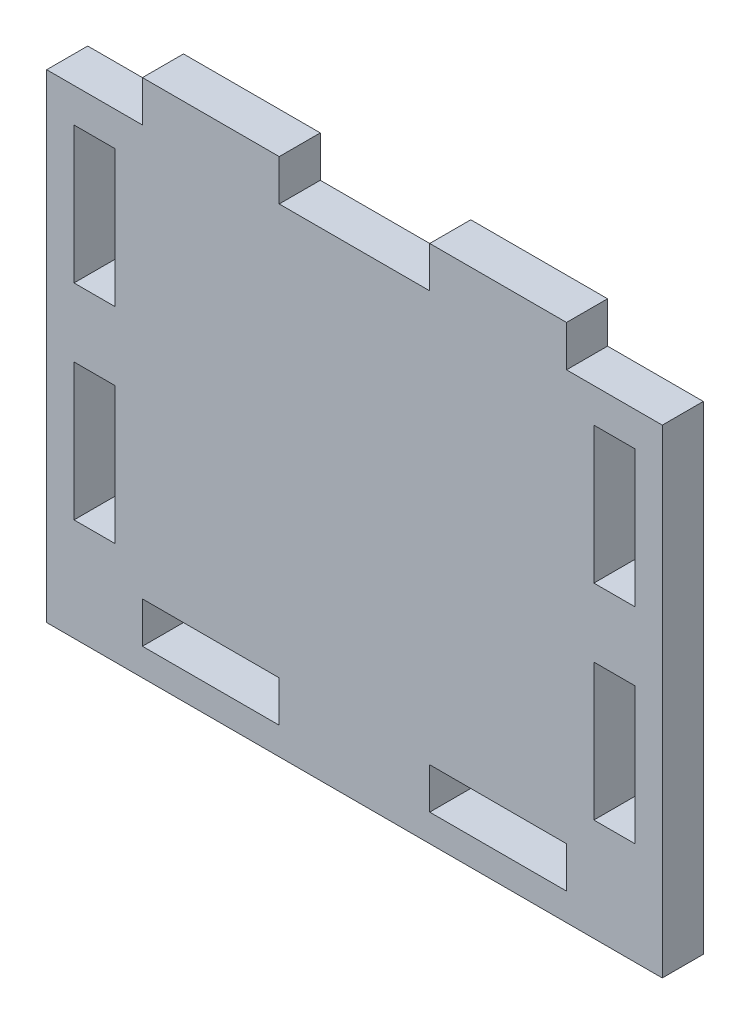
ISO-10303-21;
HEADER;
FILE_DESCRIPTION(('STEP AP214'),'2;1');
FILE_NAME('part.step','',(''),(''),'','','');
FILE_SCHEMA(('AUTOMOTIVE_DESIGN { 1 0 10303 214 1 1 1 1 }'));
ENDSEC;
DATA;
#1=APPLICATION_CONTEXT('core data for automotive mechanical design processes');
#2=APPLICATION_PROTOCOL_DEFINITION('international standard','automotive_design',2000,#1);
#3=PRODUCT_CONTEXT('',#1,'mechanical');
#4=PRODUCT('Part','Part','',(#3));
#5=PRODUCT_RELATED_PRODUCT_CATEGORY('part','',(#4));
#6=PRODUCT_DEFINITION_FORMATION('','',#4);
#7=PRODUCT_DEFINITION_CONTEXT('part definition',#1,'design');
#8=PRODUCT_DEFINITION('design','',#6,#7);
#9=PRODUCT_DEFINITION_SHAPE('','',#8);
#10=(LENGTH_UNIT() NAMED_UNIT(*) SI_UNIT(.MILLI.,.METRE.));
#11=(NAMED_UNIT(*) PLANE_ANGLE_UNIT() SI_UNIT($,.RADIAN.));
#12=(NAMED_UNIT(*) SI_UNIT($,.STERADIAN.) SOLID_ANGLE_UNIT());
#13=UNCERTAINTY_MEASURE_WITH_UNIT(LENGTH_MEASURE(1.E-05),#10,'distance_accuracy_value','');
#14=(GEOMETRIC_REPRESENTATION_CONTEXT(3) GLOBAL_UNCERTAINTY_ASSIGNED_CONTEXT((#13)) GLOBAL_UNIT_ASSIGNED_CONTEXT((#10,
#11,#12)) REPRESENTATION_CONTEXT('',''));
#15=CARTESIAN_POINT('',(0.,0.,0.));
#16=DIRECTION('',(0.,0.,1.));
#17=DIRECTION('',(1.,0.,0.));
#18=AXIS2_PLACEMENT_3D('',#15,#16,#17);
#19=CARTESIAN_POINT('',(0.,0.,3.));
#20=DIRECTION('',(0.,0.,-1.));
#21=DIRECTION('',(-1.,0.,0.));
#22=AXIS2_PLACEMENT_3D('',#19,#20,#21);
#23=PLANE('',#22);
#24=DIRECTION('',(0.,-1.,0.));
#25=VECTOR('',#24,1.);
#26=CARTESIAN_POINT('',(17.5,-12.5,3.));
#27=LINE('',#26,#25);
#28=CARTESIAN_POINT('',(17.5,-2.5,3.));
#29=VERTEX_POINT('',#28);
#30=CARTESIAN_POINT('',(17.5,-12.5,3.));
#31=VERTEX_POINT('',#30);
#32=EDGE_CURVE('E305',#29,#31,#27,.T.);
#33=ORIENTED_EDGE('',*,*,#32,.F.);
#34=DIRECTION('',(-1.,0.,0.));
#35=VECTOR('',#34,1.);
#36=CARTESIAN_POINT('',(17.5,-2.5,3.));
#37=LINE('',#36,#35);
#38=CARTESIAN_POINT('',(20.5,-2.5,3.));
#39=VERTEX_POINT('',#38);
#40=EDGE_CURVE('E313',#39,#29,#37,.T.);
#41=ORIENTED_EDGE('',*,*,#40,.F.);
#42=DIRECTION('',(0.,1.,0.));
#43=VECTOR('',#42,1.);
#44=CARTESIAN_POINT('',(20.5,-12.5,3.));
#45=LINE('',#44,#43);
#46=CARTESIAN_POINT('',(20.5,-12.5,3.));
#47=VERTEX_POINT('',#46);
#48=EDGE_CURVE('E310',#47,#39,#45,.T.);
#49=ORIENTED_EDGE('',*,*,#48,.F.);
#50=DIRECTION('',(1.,0.,0.));
#51=VECTOR('',#50,1.);
#52=CARTESIAN_POINT('',(17.5,-12.5,3.));
#53=LINE('',#52,#51);
#54=EDGE_CURVE('E307',#31,#47,#53,.T.);
#55=ORIENTED_EDGE('',*,*,#54,.F.);
#56=EDGE_LOOP('',(#33,#41,#49,#55));
#57=FACE_BOUND('',#56,.T.);
#58=DIRECTION('',(0.,1.,0.));
#59=VECTOR('',#58,1.);
#60=CARTESIAN_POINT('',(15.5,-15.,3.));
#61=LINE('',#60,#59);
#62=CARTESIAN_POINT('',(15.5,-18.,3.));
#63=VERTEX_POINT('',#62);
#64=CARTESIAN_POINT('',(15.5,-15.,3.));
#65=VERTEX_POINT('',#64);
#66=EDGE_CURVE('E367',#63,#65,#61,.T.);
#67=ORIENTED_EDGE('',*,*,#66,.F.);
#68=DIRECTION('',(1.,0.,0.));
#69=VECTOR('',#68,1.);
#70=CARTESIAN_POINT('',(15.5,-18.,3.));
#71=LINE('',#70,#69);
#72=CARTESIAN_POINT('',(5.5,-18.,3.));
#73=VERTEX_POINT('',#72);
#74=EDGE_CURVE('E375',#73,#63,#71,.T.);
#75=ORIENTED_EDGE('',*,*,#74,.F.);
#76=DIRECTION('',(0.,-1.,0.));
#77=VECTOR('',#76,1.);
#78=CARTESIAN_POINT('',(5.5,-15.,3.));
#79=LINE('',#78,#77);
#80=CARTESIAN_POINT('',(5.5,-15.,3.));
#81=VERTEX_POINT('',#80);
#82=EDGE_CURVE('E372',#81,#73,#79,.T.);
#83=ORIENTED_EDGE('',*,*,#82,.F.);
#84=DIRECTION('',(-1.,0.,0.));
#85=VECTOR('',#84,1.);
#86=CARTESIAN_POINT('',(15.5,-15.,3.));
#87=LINE('',#86,#85);
#88=EDGE_CURVE('E369',#65,#81,#87,.T.);
#89=ORIENTED_EDGE('',*,*,#88,.F.);
#90=EDGE_LOOP('',(#67,#75,#83,#89));
#91=FACE_BOUND('',#90,.T.);
#92=DIRECTION('',(0.,-1.,0.));
#93=VECTOR('',#92,1.);
#94=CARTESIAN_POINT('',(-15.5,-15.,3.));
#95=LINE('',#94,#93);
#96=CARTESIAN_POINT('',(-15.5,-15.,3.));
#97=VERTEX_POINT('',#96);
#98=CARTESIAN_POINT('',(-15.5,-18.,3.));
#99=VERTEX_POINT('',#98);
#100=EDGE_CURVE('E429',#97,#99,#95,.T.);
#101=ORIENTED_EDGE('',*,*,#100,.F.);
#102=DIRECTION('',(-1.,0.,0.));
#103=VECTOR('',#102,1.);
#104=CARTESIAN_POINT('',(-15.5,-15.,3.));
#105=LINE('',#104,#103);
#106=CARTESIAN_POINT('',(-5.5,-15.,3.));
#107=VERTEX_POINT('',#106);
#108=EDGE_CURVE('E437',#107,#97,#105,.T.);
#109=ORIENTED_EDGE('',*,*,#108,.F.);
#110=DIRECTION('',(0.,1.,0.));
#111=VECTOR('',#110,1.);
#112=CARTESIAN_POINT('',(-5.5,-15.,3.));
#113=LINE('',#112,#111);
#114=CARTESIAN_POINT('',(-5.5,-18.,3.));
#115=VERTEX_POINT('',#114);
#116=EDGE_CURVE('E434',#115,#107,#113,.T.);
#117=ORIENTED_EDGE('',*,*,#116,.F.);
#118=DIRECTION('',(1.,0.,0.));
#119=VECTOR('',#118,1.);
#120=CARTESIAN_POINT('',(-15.5,-18.,3.));
#121=LINE('',#120,#119);
#122=EDGE_CURVE('E431',#99,#115,#121,.T.);
#123=ORIENTED_EDGE('',*,*,#122,.F.);
#124=EDGE_LOOP('',(#101,#109,#117,#123));
#125=FACE_BOUND('',#124,.T.);
#126=DIRECTION('',(0.,1.,0.));
#127=VECTOR('',#126,1.);
#128=CARTESIAN_POINT('',(22.5,-20.,3.));
#129=LINE('',#128,#127);
#130=CARTESIAN_POINT('',(22.5,-20.,3.));
#131=VERTEX_POINT('',#130);
#132=CARTESIAN_POINT('',(22.5,15.,3.));
#133=VERTEX_POINT('',#132);
#134=EDGE_CURVE('E460',#131,#133,#129,.T.);
#135=ORIENTED_EDGE('',*,*,#134,.T.);
#136=DIRECTION('',(-1.,0.,0.));
#137=VECTOR('',#136,1.);
#138=CARTESIAN_POINT('',(15.5,15.,3.));
#139=LINE('',#138,#137);
#140=CARTESIAN_POINT('',(15.5,15.,3.));
#141=VERTEX_POINT('',#140);
#142=EDGE_CURVE('E462',#133,#141,#139,.T.);
#143=ORIENTED_EDGE('',*,*,#142,.T.);
#144=DIRECTION('',(0.,1.,0.));
#145=VECTOR('',#144,1.);
#146=CARTESIAN_POINT('',(15.5,15.,3.));
#147=LINE('',#146,#145);
#148=CARTESIAN_POINT('',(15.5,18.,3.));
#149=VERTEX_POINT('',#148);
#150=EDGE_CURVE('E465',#141,#149,#147,.T.);
#151=ORIENTED_EDGE('',*,*,#150,.T.);
#152=DIRECTION('',(-1.,0.,0.));
#153=VECTOR('',#152,1.);
#154=CARTESIAN_POINT('',(15.5,18.,3.));
#155=LINE('',#154,#153);
#156=CARTESIAN_POINT('',(5.5,18.,3.));
#157=VERTEX_POINT('',#156);
#158=EDGE_CURVE('E467',#149,#157,#155,.T.);
#159=ORIENTED_EDGE('',*,*,#158,.T.);
#160=DIRECTION('',(0.,-1.,0.));
#161=VECTOR('',#160,1.);
#162=CARTESIAN_POINT('',(5.5,15.,3.));
#163=LINE('',#162,#161);
#164=CARTESIAN_POINT('',(5.5,15.,3.));
#165=VERTEX_POINT('',#164);
#166=EDGE_CURVE('E469',#157,#165,#163,.T.);
#167=ORIENTED_EDGE('',*,*,#166,.T.);
#168=DIRECTION('',(-1.,0.,0.));
#169=VECTOR('',#168,1.);
#170=CARTESIAN_POINT('',(-5.5,15.,3.));
#171=LINE('',#170,#169);
#172=CARTESIAN_POINT('',(-5.5,15.,3.));
#173=VERTEX_POINT('',#172);
#174=EDGE_CURVE('E471',#165,#173,#171,.T.);
#175=ORIENTED_EDGE('',*,*,#174,.T.);
#176=DIRECTION('',(0.,1.,0.));
#177=VECTOR('',#176,1.);
#178=CARTESIAN_POINT('',(-5.5,15.,3.));
#179=LINE('',#178,#177);
#180=CARTESIAN_POINT('',(-5.5,18.,3.));
#181=VERTEX_POINT('',#180);
#182=EDGE_CURVE('E473',#173,#181,#179,.T.);
#183=ORIENTED_EDGE('',*,*,#182,.T.);
#184=DIRECTION('',(-1.,0.,0.));
#185=VECTOR('',#184,1.);
#186=CARTESIAN_POINT('',(-15.5,18.,3.));
#187=LINE('',#186,#185);
#188=CARTESIAN_POINT('',(-15.5,18.,3.));
#189=VERTEX_POINT('',#188);
#190=EDGE_CURVE('E475',#181,#189,#187,.T.);
#191=ORIENTED_EDGE('',*,*,#190,.T.);
#192=DIRECTION('',(0.,-1.,0.));
#193=VECTOR('',#192,1.);
#194=CARTESIAN_POINT('',(-15.5,15.,3.));
#195=LINE('',#194,#193);
#196=CARTESIAN_POINT('',(-15.5,15.,3.));
#197=VERTEX_POINT('',#196);
#198=EDGE_CURVE('E477',#189,#197,#195,.T.);
#199=ORIENTED_EDGE('',*,*,#198,.T.);
#200=DIRECTION('',(-1.,0.,0.));
#201=VECTOR('',#200,1.);
#202=CARTESIAN_POINT('',(-22.5,15.,3.));
#203=LINE('',#202,#201);
#204=CARTESIAN_POINT('',(-22.5,15.,3.));
#205=VERTEX_POINT('',#204);
#206=EDGE_CURVE('E479',#197,#205,#203,.T.);
#207=ORIENTED_EDGE('',*,*,#206,.T.);
#208=DIRECTION('',(0.,-1.,0.));
#209=VECTOR('',#208,1.);
#210=CARTESIAN_POINT('',(-22.5,15.,3.));
#211=LINE('',#210,#209);
#212=CARTESIAN_POINT('',(-22.5,-20.,3.));
#213=VERTEX_POINT('',#212);
#214=EDGE_CURVE('E481',#205,#213,#211,.T.);
#215=ORIENTED_EDGE('',*,*,#214,.T.);
#216=DIRECTION('',(1.,0.,0.));
#217=VECTOR('',#216,1.);
#218=CARTESIAN_POINT('',(-22.5,-20.,3.));
#219=LINE('',#218,#217);
#220=EDGE_CURVE('E483',#213,#131,#219,.T.);
#221=ORIENTED_EDGE('',*,*,#220,.T.);
#222=EDGE_LOOP('',(#135,#143,#151,#159,#167,#175,#183,#191,#199,#207,#215,#221));
#223=FACE_BOUND('',#222,.T.);
#224=DIRECTION('',(0.,1.,0.));
#225=VECTOR('',#224,1.);
#226=CARTESIAN_POINT('',(-17.5,-12.5,3.));
#227=LINE('',#226,#225);
#228=CARTESIAN_POINT('',(-17.5,-12.5,3.));
#229=VERTEX_POINT('',#228);
#230=CARTESIAN_POINT('',(-17.5,-2.5,3.));
#231=VERTEX_POINT('',#230);
#232=EDGE_CURVE('E398',#229,#231,#227,.T.);
#233=ORIENTED_EDGE('',*,*,#232,.F.);
#234=DIRECTION('',(1.,0.,0.));
#235=VECTOR('',#234,1.);
#236=CARTESIAN_POINT('',(-17.5,-12.5,3.));
#237=LINE('',#236,#235);
#238=CARTESIAN_POINT('',(-20.5,-12.5,3.));
#239=VERTEX_POINT('',#238);
#240=EDGE_CURVE('E406',#239,#229,#237,.T.);
#241=ORIENTED_EDGE('',*,*,#240,.F.);
#242=DIRECTION('',(0.,-1.,0.));
#243=VECTOR('',#242,1.);
#244=CARTESIAN_POINT('',(-20.5,-12.5,3.));
#245=LINE('',#244,#243);
#246=CARTESIAN_POINT('',(-20.5,-2.5,3.));
#247=VERTEX_POINT('',#246);
#248=EDGE_CURVE('E403',#247,#239,#245,.T.);
#249=ORIENTED_EDGE('',*,*,#248,.F.);
#250=DIRECTION('',(-1.,0.,0.));
#251=VECTOR('',#250,1.);
#252=CARTESIAN_POINT('',(-17.5,-2.5,3.));
#253=LINE('',#252,#251);
#254=EDGE_CURVE('E400',#231,#247,#253,.T.);
#255=ORIENTED_EDGE('',*,*,#254,.F.);
#256=EDGE_LOOP('',(#233,#241,#249,#255));
#257=FACE_BOUND('',#256,.T.);
#258=DIRECTION('',(0.,1.,0.));
#259=VECTOR('',#258,1.);
#260=CARTESIAN_POINT('',(-17.5,12.5,3.));
#261=LINE('',#260,#259);
#262=CARTESIAN_POINT('',(-17.5,2.5,3.));
#263=VERTEX_POINT('',#262);
#264=CARTESIAN_POINT('',(-17.5,12.5,3.));
#265=VERTEX_POINT('',#264);
#266=EDGE_CURVE('E336',#263,#265,#261,.T.);
#267=ORIENTED_EDGE('',*,*,#266,.F.);
#268=DIRECTION('',(1.,0.,0.));
#269=VECTOR('',#268,1.);
#270=CARTESIAN_POINT('',(-17.5,2.5,3.));
#271=LINE('',#270,#269);
#272=CARTESIAN_POINT('',(-20.5,2.5,3.));
#273=VERTEX_POINT('',#272);
#274=EDGE_CURVE('E344',#273,#263,#271,.T.);
#275=ORIENTED_EDGE('',*,*,#274,.F.);
#276=DIRECTION('',(0.,-1.,0.));
#277=VECTOR('',#276,1.);
#278=CARTESIAN_POINT('',(-20.5,12.5,3.));
#279=LINE('',#278,#277);
#280=CARTESIAN_POINT('',(-20.5,12.5,3.));
#281=VERTEX_POINT('',#280);
#282=EDGE_CURVE('E341',#281,#273,#279,.T.);
#283=ORIENTED_EDGE('',*,*,#282,.F.);
#284=DIRECTION('',(-1.,0.,0.));
#285=VECTOR('',#284,1.);
#286=CARTESIAN_POINT('',(-17.5,12.5,3.));
#287=LINE('',#286,#285);
#288=EDGE_CURVE('E338',#265,#281,#287,.T.);
#289=ORIENTED_EDGE('',*,*,#288,.F.);
#290=EDGE_LOOP('',(#267,#275,#283,#289));
#291=FACE_BOUND('',#290,.T.);
#292=DIRECTION('',(-1.,0.,0.));
#293=VECTOR('',#292,1.);
#294=CARTESIAN_POINT('',(17.5,12.5,3.));
#295=LINE('',#294,#293);
#296=CARTESIAN_POINT('',(20.5,12.5,3.));
#297=VERTEX_POINT('',#296);
#298=CARTESIAN_POINT('',(17.5,12.5,3.));
#299=VERTEX_POINT('',#298);
#300=EDGE_CURVE('E269',#297,#299,#295,.T.);
#301=ORIENTED_EDGE('',*,*,#300,.F.);
#302=DIRECTION('',(0.,1.,0.));
#303=VECTOR('',#302,1.);
#304=CARTESIAN_POINT('',(20.5,12.5,3.));
#305=LINE('',#304,#303);
#306=CARTESIAN_POINT('',(20.5,2.5,3.));
#307=VERTEX_POINT('',#306);
#308=EDGE_CURVE('E291',#307,#297,#305,.T.);
#309=ORIENTED_EDGE('',*,*,#308,.F.);
#310=DIRECTION('',(1.,0.,0.));
#311=VECTOR('',#310,1.);
#312=CARTESIAN_POINT('',(17.5,2.5,3.));
#313=LINE('',#312,#311);
#314=CARTESIAN_POINT('',(17.5,2.5,3.));
#315=VERTEX_POINT('',#314);
#316=EDGE_CURVE('E289',#315,#307,#313,.T.);
#317=ORIENTED_EDGE('',*,*,#316,.F.);
#318=DIRECTION('',(0.,-1.,0.));
#319=VECTOR('',#318,1.);
#320=CARTESIAN_POINT('',(17.5,12.5,3.));
#321=LINE('',#320,#319);
#322=EDGE_CURVE('E277',#299,#315,#321,.T.);
#323=ORIENTED_EDGE('',*,*,#322,.F.);
#324=EDGE_LOOP('',(#301,#309,#317,#323));
#325=FACE_BOUND('',#324,.T.);
#326=ADVANCED_FACE('F36',(#57,#91,#125,#223,#257,#291,#325),#23,.F.);
#327=CARTESIAN_POINT('',(0.,0.,0.));
#328=DIRECTION('',(0.,0.,-1.));
#329=DIRECTION('',(-1.,0.,0.));
#330=AXIS2_PLACEMENT_3D('',#327,#328,#329);
#331=PLANE('',#330);
#332=DIRECTION('',(0.,1.,0.));
#333=VECTOR('',#332,1.);
#334=CARTESIAN_POINT('',(22.5,15.,0.));
#335=LINE('',#334,#333);
#336=CARTESIAN_POINT('',(22.5,-20.,0.));
#337=VERTEX_POINT('',#336);
#338=CARTESIAN_POINT('',(22.5,15.,0.));
#339=VERTEX_POINT('',#338);
#340=EDGE_CURVE('E459',#337,#339,#335,.T.);
#341=ORIENTED_EDGE('',*,*,#340,.F.);
#342=DIRECTION('',(1.,0.,0.));
#343=VECTOR('',#342,1.);
#344=CARTESIAN_POINT('',(-22.5,-20.,0.));
#345=LINE('',#344,#343);
#346=CARTESIAN_POINT('',(-22.5,-20.,0.));
#347=VERTEX_POINT('',#346);
#348=EDGE_CURVE('E463',#347,#337,#345,.T.);
#349=ORIENTED_EDGE('',*,*,#348,.F.);
#350=DIRECTION('',(0.,-1.,0.));
#351=VECTOR('',#350,1.);
#352=CARTESIAN_POINT('',(-22.5,-15.,0.));
#353=LINE('',#352,#351);
#354=CARTESIAN_POINT('',(-22.5,15.,0.));
#355=VERTEX_POINT('',#354);
#356=EDGE_CURVE('E506',#355,#347,#353,.T.);
#357=ORIENTED_EDGE('',*,*,#356,.F.);
#358=DIRECTION('',(-1.,0.,0.));
#359=VECTOR('',#358,1.);
#360=CARTESIAN_POINT('',(-22.5,15.,0.));
#361=LINE('',#360,#359);
#362=CARTESIAN_POINT('',(-15.5,15.,0.));
#363=VERTEX_POINT('',#362);
#364=EDGE_CURVE('E503',#363,#355,#361,.T.);
#365=ORIENTED_EDGE('',*,*,#364,.F.);
#366=DIRECTION('',(0.,-1.,0.));
#367=VECTOR('',#366,1.);
#368=CARTESIAN_POINT('',(-15.5,15.,0.));
#369=LINE('',#368,#367);
#370=CARTESIAN_POINT('',(-15.5,18.,0.));
#371=VERTEX_POINT('',#370);
#372=EDGE_CURVE('E501',#371,#363,#369,.T.);
#373=ORIENTED_EDGE('',*,*,#372,.F.);
#374=DIRECTION('',(-1.,0.,0.));
#375=VECTOR('',#374,1.);
#376=CARTESIAN_POINT('',(-15.5,18.,0.));
#377=LINE('',#376,#375);
#378=CARTESIAN_POINT('',(-5.5,18.,0.));
#379=VERTEX_POINT('',#378);
#380=EDGE_CURVE('E499',#379,#371,#377,.T.);
#381=ORIENTED_EDGE('',*,*,#380,.F.);
#382=DIRECTION('',(0.,1.,0.));
#383=VECTOR('',#382,1.);
#384=CARTESIAN_POINT('',(-5.5,15.,0.));
#385=LINE('',#384,#383);
#386=CARTESIAN_POINT('',(-5.5,15.,0.));
#387=VERTEX_POINT('',#386);
#388=EDGE_CURVE('E497',#387,#379,#385,.T.);
#389=ORIENTED_EDGE('',*,*,#388,.F.);
#390=DIRECTION('',(-1.,0.,0.));
#391=VECTOR('',#390,1.);
#392=CARTESIAN_POINT('',(-5.5,15.,0.));
#393=LINE('',#392,#391);
#394=CARTESIAN_POINT('',(5.5,15.,0.));
#395=VERTEX_POINT('',#394);
#396=EDGE_CURVE('E495',#395,#387,#393,.T.);
#397=ORIENTED_EDGE('',*,*,#396,.F.);
#398=DIRECTION('',(0.,-1.,0.));
#399=VECTOR('',#398,1.);
#400=CARTESIAN_POINT('',(5.5,15.,0.));
#401=LINE('',#400,#399);
#402=CARTESIAN_POINT('',(5.5,18.,0.));
#403=VERTEX_POINT('',#402);
#404=EDGE_CURVE('E493',#403,#395,#401,.T.);
#405=ORIENTED_EDGE('',*,*,#404,.F.);
#406=DIRECTION('',(-1.,0.,0.));
#407=VECTOR('',#406,1.);
#408=CARTESIAN_POINT('',(15.5,18.,0.));
#409=LINE('',#408,#407);
#410=CARTESIAN_POINT('',(15.5,18.,0.));
#411=VERTEX_POINT('',#410);
#412=EDGE_CURVE('E491',#411,#403,#409,.T.);
#413=ORIENTED_EDGE('',*,*,#412,.F.);
#414=DIRECTION('',(0.,1.,0.));
#415=VECTOR('',#414,1.);
#416=CARTESIAN_POINT('',(15.5,15.,0.));
#417=LINE('',#416,#415);
#418=CARTESIAN_POINT('',(15.5,15.,0.));
#419=VERTEX_POINT('',#418);
#420=EDGE_CURVE('E489',#419,#411,#417,.T.);
#421=ORIENTED_EDGE('',*,*,#420,.F.);
#422=DIRECTION('',(-1.,0.,0.));
#423=VECTOR('',#422,1.);
#424=CARTESIAN_POINT('',(15.5,15.,0.));
#425=LINE('',#424,#423);
#426=EDGE_CURVE('E487',#339,#419,#425,.T.);
#427=ORIENTED_EDGE('',*,*,#426,.F.);
#428=EDGE_LOOP('',(#341,#349,#357,#365,#373,#381,#389,#397,#405,#413,#421,#427));
#429=FACE_BOUND('',#428,.T.);
#430=DIRECTION('',(-1.,0.,0.));
#431=VECTOR('',#430,1.);
#432=CARTESIAN_POINT('',(-15.5,-15.,0.));
#433=LINE('',#432,#431);
#434=CARTESIAN_POINT('',(-5.5,-15.,0.));
#435=VERTEX_POINT('',#434);
#436=CARTESIAN_POINT('',(-15.5,-15.,0.));
#437=VERTEX_POINT('',#436);
#438=EDGE_CURVE('E432',#435,#437,#433,.T.);
#439=ORIENTED_EDGE('',*,*,#438,.T.);
#440=DIRECTION('',(0.,-1.,0.));
#441=VECTOR('',#440,1.);
#442=CARTESIAN_POINT('',(-15.5,-15.,0.));
#443=LINE('',#442,#441);
#444=CARTESIAN_POINT('',(-15.5,-18.,0.));
#445=VERTEX_POINT('',#444);
#446=EDGE_CURVE('E428',#437,#445,#443,.T.);
#447=ORIENTED_EDGE('',*,*,#446,.T.);
#448=DIRECTION('',(1.,0.,0.));
#449=VECTOR('',#448,1.);
#450=CARTESIAN_POINT('',(-15.5,-18.,0.));
#451=LINE('',#450,#449);
#452=CARTESIAN_POINT('',(-5.5,-18.,0.));
#453=VERTEX_POINT('',#452);
#454=EDGE_CURVE('E442',#445,#453,#451,.T.);
#455=ORIENTED_EDGE('',*,*,#454,.T.);
#456=DIRECTION('',(0.,1.,0.));
#457=VECTOR('',#456,1.);
#458=CARTESIAN_POINT('',(-5.5,-15.,0.));
#459=LINE('',#458,#457);
#460=EDGE_CURVE('E445',#453,#435,#459,.T.);
#461=ORIENTED_EDGE('',*,*,#460,.T.);
#462=EDGE_LOOP('',(#439,#447,#455,#461));
#463=FACE_BOUND('',#462,.T.);
#464=DIRECTION('',(1.,0.,0.));
#465=VECTOR('',#464,1.);
#466=CARTESIAN_POINT('',(-17.5,-12.5,0.));
#467=LINE('',#466,#465);
#468=CARTESIAN_POINT('',(-20.5,-12.5,0.));
#469=VERTEX_POINT('',#468);
#470=CARTESIAN_POINT('',(-17.5,-12.5,0.));
#471=VERTEX_POINT('',#470);
#472=EDGE_CURVE('E401',#469,#471,#467,.T.);
#473=ORIENTED_EDGE('',*,*,#472,.T.);
#474=DIRECTION('',(0.,1.,0.));
#475=VECTOR('',#474,1.);
#476=CARTESIAN_POINT('',(-17.5,-12.5,0.));
#477=LINE('',#476,#475);
#478=CARTESIAN_POINT('',(-17.5,-2.5,0.));
#479=VERTEX_POINT('',#478);
#480=EDGE_CURVE('E397',#471,#479,#477,.T.);
#481=ORIENTED_EDGE('',*,*,#480,.T.);
#482=DIRECTION('',(-1.,0.,0.));
#483=VECTOR('',#482,1.);
#484=CARTESIAN_POINT('',(-17.5,-2.5,0.));
#485=LINE('',#484,#483);
#486=CARTESIAN_POINT('',(-20.5,-2.5,0.));
#487=VERTEX_POINT('',#486);
#488=EDGE_CURVE('E411',#479,#487,#485,.T.);
#489=ORIENTED_EDGE('',*,*,#488,.T.);
#490=DIRECTION('',(0.,-1.,0.));
#491=VECTOR('',#490,1.);
#492=CARTESIAN_POINT('',(-20.5,-12.5,0.));
#493=LINE('',#492,#491);
#494=EDGE_CURVE('E414',#487,#469,#493,.T.);
#495=ORIENTED_EDGE('',*,*,#494,.T.);
#496=EDGE_LOOP('',(#473,#481,#489,#495));
#497=FACE_BOUND('',#496,.T.);
#498=DIRECTION('',(1.,0.,0.));
#499=VECTOR('',#498,1.);
#500=CARTESIAN_POINT('',(15.5,-18.,0.));
#501=LINE('',#500,#499);
#502=CARTESIAN_POINT('',(5.5,-18.,0.));
#503=VERTEX_POINT('',#502);
#504=CARTESIAN_POINT('',(15.5,-18.,0.));
#505=VERTEX_POINT('',#504);
#506=EDGE_CURVE('E370',#503,#505,#501,.T.);
#507=ORIENTED_EDGE('',*,*,#506,.T.);
#508=DIRECTION('',(0.,1.,0.));
#509=VECTOR('',#508,1.);
#510=CARTESIAN_POINT('',(15.5,-15.,0.));
#511=LINE('',#510,#509);
#512=CARTESIAN_POINT('',(15.5,-15.,0.));
#513=VERTEX_POINT('',#512);
#514=EDGE_CURVE('E366',#505,#513,#511,.T.);
#515=ORIENTED_EDGE('',*,*,#514,.T.);
#516=DIRECTION('',(-1.,0.,0.));
#517=VECTOR('',#516,1.);
#518=CARTESIAN_POINT('',(15.5,-15.,0.));
#519=LINE('',#518,#517);
#520=CARTESIAN_POINT('',(5.5,-15.,0.));
#521=VERTEX_POINT('',#520);
#522=EDGE_CURVE('E380',#513,#521,#519,.T.);
#523=ORIENTED_EDGE('',*,*,#522,.T.);
#524=DIRECTION('',(0.,-1.,0.));
#525=VECTOR('',#524,1.);
#526=CARTESIAN_POINT('',(5.5,-15.,0.));
#527=LINE('',#526,#525);
#528=EDGE_CURVE('E383',#521,#503,#527,.T.);
#529=ORIENTED_EDGE('',*,*,#528,.T.);
#530=EDGE_LOOP('',(#507,#515,#523,#529));
#531=FACE_BOUND('',#530,.T.);
#532=DIRECTION('',(1.,0.,0.));
#533=VECTOR('',#532,1.);
#534=CARTESIAN_POINT('',(-17.5,2.5,0.));
#535=LINE('',#534,#533);
#536=CARTESIAN_POINT('',(-20.5,2.5,0.));
#537=VERTEX_POINT('',#536);
#538=CARTESIAN_POINT('',(-17.5,2.5,0.));
#539=VERTEX_POINT('',#538);
#540=EDGE_CURVE('E339',#537,#539,#535,.T.);
#541=ORIENTED_EDGE('',*,*,#540,.T.);
#542=DIRECTION('',(0.,1.,0.));
#543=VECTOR('',#542,1.);
#544=CARTESIAN_POINT('',(-17.5,12.5,0.));
#545=LINE('',#544,#543);
#546=CARTESIAN_POINT('',(-17.5,12.5,0.));
#547=VERTEX_POINT('',#546);
#548=EDGE_CURVE('E335',#539,#547,#545,.T.);
#549=ORIENTED_EDGE('',*,*,#548,.T.);
#550=DIRECTION('',(-1.,0.,0.));
#551=VECTOR('',#550,1.);
#552=CARTESIAN_POINT('',(-17.5,12.5,0.));
#553=LINE('',#552,#551);
#554=CARTESIAN_POINT('',(-20.5,12.5,0.));
#555=VERTEX_POINT('',#554);
#556=EDGE_CURVE('E349',#547,#555,#553,.T.);
#557=ORIENTED_EDGE('',*,*,#556,.T.);
#558=DIRECTION('',(0.,-1.,0.));
#559=VECTOR('',#558,1.);
#560=CARTESIAN_POINT('',(-20.5,12.5,0.));
#561=LINE('',#560,#559);
#562=EDGE_CURVE('E352',#555,#537,#561,.T.);
#563=ORIENTED_EDGE('',*,*,#562,.T.);
#564=EDGE_LOOP('',(#541,#549,#557,#563));
#565=FACE_BOUND('',#564,.T.);
#566=DIRECTION('',(-1.,0.,0.));
#567=VECTOR('',#566,1.);
#568=CARTESIAN_POINT('',(17.5,-2.5,0.));
#569=LINE('',#568,#567);
#570=CARTESIAN_POINT('',(20.5,-2.5,0.));
#571=VERTEX_POINT('',#570);
#572=CARTESIAN_POINT('',(17.5,-2.5,0.));
#573=VERTEX_POINT('',#572);
#574=EDGE_CURVE('E308',#571,#573,#569,.T.);
#575=ORIENTED_EDGE('',*,*,#574,.T.);
#576=DIRECTION('',(0.,-1.,0.));
#577=VECTOR('',#576,1.);
#578=CARTESIAN_POINT('',(17.5,-12.5,0.));
#579=LINE('',#578,#577);
#580=CARTESIAN_POINT('',(17.5,-12.5,0.));
#581=VERTEX_POINT('',#580);
#582=EDGE_CURVE('E285',#573,#581,#579,.T.);
#583=ORIENTED_EDGE('',*,*,#582,.T.);
#584=DIRECTION('',(1.,0.,0.));
#585=VECTOR('',#584,1.);
#586=CARTESIAN_POINT('',(17.5,-12.5,0.));
#587=LINE('',#586,#585);
#588=CARTESIAN_POINT('',(20.5,-12.5,0.));
#589=VERTEX_POINT('',#588);
#590=EDGE_CURVE('E318',#581,#589,#587,.T.);
#591=ORIENTED_EDGE('',*,*,#590,.T.);
#592=DIRECTION('',(0.,1.,0.));
#593=VECTOR('',#592,1.);
#594=CARTESIAN_POINT('',(20.5,-12.5,0.));
#595=LINE('',#594,#593);
#596=EDGE_CURVE('E321',#589,#571,#595,.T.);
#597=ORIENTED_EDGE('',*,*,#596,.T.);
#598=EDGE_LOOP('',(#575,#583,#591,#597));
#599=FACE_BOUND('',#598,.T.);
#600=DIRECTION('',(0.,1.,0.));
#601=VECTOR('',#600,1.);
#602=CARTESIAN_POINT('',(20.5,12.5,0.));
#603=LINE('',#602,#601);
#604=CARTESIAN_POINT('',(20.5,2.5,0.));
#605=VERTEX_POINT('',#604);
#606=CARTESIAN_POINT('',(20.5,12.5,0.));
#607=VERTEX_POINT('',#606);
#608=EDGE_CURVE('E278',#605,#607,#603,.T.);
#609=ORIENTED_EDGE('',*,*,#608,.T.);
#610=DIRECTION('',(-1.,0.,0.));
#611=VECTOR('',#610,1.);
#612=CARTESIAN_POINT('',(17.5,12.5,0.));
#613=LINE('',#612,#611);
#614=CARTESIAN_POINT('',(17.5,12.5,0.));
#615=VERTEX_POINT('',#614);
#616=EDGE_CURVE('E59',#607,#615,#613,.T.);
#617=ORIENTED_EDGE('',*,*,#616,.T.);
#618=DIRECTION('',(0.,-1.,0.));
#619=VECTOR('',#618,1.);
#620=CARTESIAN_POINT('',(17.5,12.5,0.));
#621=LINE('',#620,#619);
#622=CARTESIAN_POINT('',(17.5,2.5,0.));
#623=VERTEX_POINT('',#622);
#624=EDGE_CURVE('E284',#615,#623,#621,.T.);
#625=ORIENTED_EDGE('',*,*,#624,.T.);
#626=DIRECTION('',(1.,0.,0.));
#627=VECTOR('',#626,1.);
#628=CARTESIAN_POINT('',(17.5,2.5,0.));
#629=LINE('',#628,#627);
#630=EDGE_CURVE('E297',#623,#605,#629,.T.);
#631=ORIENTED_EDGE('',*,*,#630,.T.);
#632=EDGE_LOOP('',(#609,#617,#625,#631));
#633=FACE_BOUND('',#632,.T.);
#634=ADVANCED_FACE('F550',(#429,#463,#497,#531,#565,#599,#633),#331,.T.);
#635=CARTESIAN_POINT('',(22.5,15.,3.));
#636=DIRECTION('',(-1.,0.,0.));
#637=DIRECTION('',(0.,-1.,0.));
#638=AXIS2_PLACEMENT_3D('',#635,#636,#637);
#639=PLANE('',#638);
#640=ORIENTED_EDGE('',*,*,#340,.T.);
#641=DIRECTION('',(0.,0.,-1.));
#642=VECTOR('',#641,1.);
#643=CARTESIAN_POINT('',(22.5,15.,3.));
#644=LINE('',#643,#642);
#645=EDGE_CURVE('E11',#133,#339,#644,.T.);
#646=ORIENTED_EDGE('',*,*,#645,.F.);
#647=ORIENTED_EDGE('',*,*,#134,.F.);
#648=DIRECTION('',(0.,0.,-1.));
#649=VECTOR('',#648,1.);
#650=CARTESIAN_POINT('',(22.5,-20.,3.));
#651=LINE('',#650,#649);
#652=EDGE_CURVE('E485',#131,#337,#651,.T.);
#653=ORIENTED_EDGE('',*,*,#652,.T.);
#654=EDGE_LOOP('',(#640,#646,#647,#653));
#655=FACE_BOUND('',#654,.T.);
#656=ADVANCED_FACE('F38',(#655),#639,.F.);
#657=CARTESIAN_POINT('',(15.5,15.,3.));
#658=DIRECTION('',(0.,-1.,0.));
#659=DIRECTION('',(0.,0.,-1.));
#660=AXIS2_PLACEMENT_3D('',#657,#658,#659);
#661=PLANE('',#660);
#662=ORIENTED_EDGE('',*,*,#426,.T.);
#663=DIRECTION('',(0.,0.,-1.));
#664=VECTOR('',#663,1.);
#665=CARTESIAN_POINT('',(15.5,15.,3.));
#666=LINE('',#665,#664);
#667=EDGE_CURVE('E44',#141,#419,#666,.T.);
#668=ORIENTED_EDGE('',*,*,#667,.F.);
#669=ORIENTED_EDGE('',*,*,#142,.F.);
#670=ORIENTED_EDGE('',*,*,#645,.T.);
#671=EDGE_LOOP('',(#662,#668,#669,#670));
#672=FACE_BOUND('',#671,.T.);
#673=ADVANCED_FACE('F568',(#672),#661,.F.);
#674=CARTESIAN_POINT('',(15.5,15.,3.));
#675=DIRECTION('',(-1.,0.,0.));
#676=DIRECTION('',(0.,-1.,0.));
#677=AXIS2_PLACEMENT_3D('',#674,#675,#676);
#678=PLANE('',#677);
#679=ORIENTED_EDGE('',*,*,#420,.T.);
#680=DIRECTION('',(0.,0.,-1.));
#681=VECTOR('',#680,1.);
#682=CARTESIAN_POINT('',(15.5,18.,3.));
#683=LINE('',#682,#681);
#684=EDGE_CURVE('E536',#149,#411,#683,.T.);
#685=ORIENTED_EDGE('',*,*,#684,.F.);
#686=ORIENTED_EDGE('',*,*,#150,.F.);
#687=ORIENTED_EDGE('',*,*,#667,.T.);
#688=EDGE_LOOP('',(#679,#685,#686,#687));
#689=FACE_BOUND('',#688,.T.);
#690=ADVANCED_FACE('F543',(#689),#678,.F.);
#691=CARTESIAN_POINT('',(15.5,18.,3.));
#692=DIRECTION('',(0.,-1.,0.));
#693=DIRECTION('',(0.,0.,-1.));
#694=AXIS2_PLACEMENT_3D('',#691,#692,#693);
#695=PLANE('',#694);
#696=ORIENTED_EDGE('',*,*,#412,.T.);
#697=DIRECTION('',(0.,0.,-1.));
#698=VECTOR('',#697,1.);
#699=CARTESIAN_POINT('',(5.5,18.,3.));
#700=LINE('',#699,#698);
#701=EDGE_CURVE('E533',#157,#403,#700,.T.);
#702=ORIENTED_EDGE('',*,*,#701,.F.);
#703=ORIENTED_EDGE('',*,*,#158,.F.);
#704=ORIENTED_EDGE('',*,*,#684,.T.);
#705=EDGE_LOOP('',(#696,#702,#703,#704));
#706=FACE_BOUND('',#705,.T.);
#707=ADVANCED_FACE('F556',(#706),#695,.F.);
#708=CARTESIAN_POINT('',(5.5,15.,3.));
#709=DIRECTION('',(1.,0.,0.));
#710=DIRECTION('',(0.,0.,-1.));
#711=AXIS2_PLACEMENT_3D('',#708,#709,#710);
#712=PLANE('',#711);
#713=ORIENTED_EDGE('',*,*,#404,.T.);
#714=DIRECTION('',(0.,0.,-1.));
#715=VECTOR('',#714,1.);
#716=CARTESIAN_POINT('',(5.5,15.,3.));
#717=LINE('',#716,#715);
#718=EDGE_CURVE('E530',#165,#395,#717,.T.);
#719=ORIENTED_EDGE('',*,*,#718,.F.);
#720=ORIENTED_EDGE('',*,*,#166,.F.);
#721=ORIENTED_EDGE('',*,*,#701,.T.);
#722=EDGE_LOOP('',(#713,#719,#720,#721));
#723=FACE_BOUND('',#722,.T.);
#724=ADVANCED_FACE('F560',(#723),#712,.F.);
#725=CARTESIAN_POINT('',(-5.5,15.,3.));
#726=DIRECTION('',(0.,-1.,0.));
#727=DIRECTION('',(0.,0.,-1.));
#728=AXIS2_PLACEMENT_3D('',#725,#726,#727);
#729=PLANE('',#728);
#730=ORIENTED_EDGE('',*,*,#396,.T.);
#731=DIRECTION('',(0.,0.,-1.));
#732=VECTOR('',#731,1.);
#733=CARTESIAN_POINT('',(-5.5,15.,3.));
#734=LINE('',#733,#732);
#735=EDGE_CURVE('E527',#173,#387,#734,.T.);
#736=ORIENTED_EDGE('',*,*,#735,.F.);
#737=ORIENTED_EDGE('',*,*,#174,.F.);
#738=ORIENTED_EDGE('',*,*,#718,.T.);
#739=EDGE_LOOP('',(#730,#736,#737,#738));
#740=FACE_BOUND('',#739,.T.);
#741=ADVANCED_FACE('F600',(#740),#729,.F.);
#742=CARTESIAN_POINT('',(-5.5,15.,3.));
#743=DIRECTION('',(-1.,0.,0.));
#744=DIRECTION('',(0.,0.,1.));
#745=AXIS2_PLACEMENT_3D('',#742,#743,#744);
#746=PLANE('',#745);
#747=ORIENTED_EDGE('',*,*,#388,.T.);
#748=DIRECTION('',(0.,0.,-1.));
#749=VECTOR('',#748,1.);
#750=CARTESIAN_POINT('',(-5.5,18.,3.));
#751=LINE('',#750,#749);
#752=EDGE_CURVE('E524',#181,#379,#751,.T.);
#753=ORIENTED_EDGE('',*,*,#752,.F.);
#754=ORIENTED_EDGE('',*,*,#182,.F.);
#755=ORIENTED_EDGE('',*,*,#735,.T.);
#756=EDGE_LOOP('',(#747,#753,#754,#755));
#757=FACE_BOUND('',#756,.T.);
#758=ADVANCED_FACE('F598',(#757),#746,.F.);
#759=CARTESIAN_POINT('',(-15.5,18.,3.));
#760=DIRECTION('',(0.,-1.,0.));
#761=DIRECTION('',(0.,0.,-1.));
#762=AXIS2_PLACEMENT_3D('',#759,#760,#761);
#763=PLANE('',#762);
#764=ORIENTED_EDGE('',*,*,#380,.T.);
#765=DIRECTION('',(0.,0.,-1.));
#766=VECTOR('',#765,1.);
#767=CARTESIAN_POINT('',(-15.5,18.,3.));
#768=LINE('',#767,#766);
#769=EDGE_CURVE('E521',#189,#371,#768,.T.);
#770=ORIENTED_EDGE('',*,*,#769,.F.);
#771=ORIENTED_EDGE('',*,*,#190,.F.);
#772=ORIENTED_EDGE('',*,*,#752,.T.);
#773=EDGE_LOOP('',(#764,#770,#771,#772));
#774=FACE_BOUND('',#773,.T.);
#775=ADVANCED_FACE('F593',(#774),#763,.F.);
#776=CARTESIAN_POINT('',(-15.5,15.,3.));
#777=DIRECTION('',(1.,0.,0.));
#778=DIRECTION('',(0.,1.,0.));
#779=AXIS2_PLACEMENT_3D('',#776,#777,#778);
#780=PLANE('',#779);
#781=ORIENTED_EDGE('',*,*,#372,.T.);
#782=DIRECTION('',(0.,0.,-1.));
#783=VECTOR('',#782,1.);
#784=CARTESIAN_POINT('',(-15.5,15.,3.));
#785=LINE('',#784,#783);
#786=EDGE_CURVE('E518',#197,#363,#785,.T.);
#787=ORIENTED_EDGE('',*,*,#786,.F.);
#788=ORIENTED_EDGE('',*,*,#198,.F.);
#789=ORIENTED_EDGE('',*,*,#769,.T.);
#790=EDGE_LOOP('',(#781,#787,#788,#789));
#791=FACE_BOUND('',#790,.T.);
#792=ADVANCED_FACE('F588',(#791),#780,.F.);
#793=CARTESIAN_POINT('',(-22.5,15.,3.));
#794=DIRECTION('',(0.,-1.,0.));
#795=DIRECTION('',(0.,0.,-1.));
#796=AXIS2_PLACEMENT_3D('',#793,#794,#795);
#797=PLANE('',#796);
#798=ORIENTED_EDGE('',*,*,#364,.T.);
#799=DIRECTION('',(0.,0.,-1.));
#800=VECTOR('',#799,1.);
#801=CARTESIAN_POINT('',(-22.5,15.,3.));
#802=LINE('',#801,#800);
#803=EDGE_CURVE('E515',#205,#355,#802,.T.);
#804=ORIENTED_EDGE('',*,*,#803,.F.);
#805=ORIENTED_EDGE('',*,*,#206,.F.);
#806=ORIENTED_EDGE('',*,*,#786,.T.);
#807=EDGE_LOOP('',(#798,#804,#805,#806));
#808=FACE_BOUND('',#807,.T.);
#809=ADVANCED_FACE('F583',(#808),#797,.F.);
#810=CARTESIAN_POINT('',(-22.5,-15.,3.));
#811=DIRECTION('',(1.,0.,0.));
#812=DIRECTION('',(0.,0.,-1.));
#813=AXIS2_PLACEMENT_3D('',#810,#811,#812);
#814=PLANE('',#813);
#815=ORIENTED_EDGE('',*,*,#356,.T.);
#816=DIRECTION('',(0.,0.,-1.));
#817=VECTOR('',#816,1.);
#818=CARTESIAN_POINT('',(-22.5,-20.,3.));
#819=LINE('',#818,#817);
#820=EDGE_CURVE('E512',#213,#347,#819,.T.);
#821=ORIENTED_EDGE('',*,*,#820,.F.);
#822=ORIENTED_EDGE('',*,*,#214,.F.);
#823=ORIENTED_EDGE('',*,*,#803,.T.);
#824=EDGE_LOOP('',(#815,#821,#822,#823));
#825=FACE_BOUND('',#824,.T.);
#826=ADVANCED_FACE('F578',(#825),#814,.F.);
#827=CARTESIAN_POINT('',(-22.5,-20.,3.));
#828=DIRECTION('',(0.,1.,0.));
#829=DIRECTION('',(0.,0.,1.));
#830=AXIS2_PLACEMENT_3D('',#827,#828,#829);
#831=PLANE('',#830);
#832=ORIENTED_EDGE('',*,*,#348,.T.);
#833=ORIENTED_EDGE('',*,*,#652,.F.);
#834=ORIENTED_EDGE('',*,*,#220,.F.);
#835=ORIENTED_EDGE('',*,*,#820,.T.);
#836=EDGE_LOOP('',(#832,#833,#834,#835));
#837=FACE_BOUND('',#836,.T.);
#838=ADVANCED_FACE('F573',(#837),#831,.F.);
#839=CARTESIAN_POINT('',(-15.5,-15.,3.));
#840=DIRECTION('',(1.,0.,0.));
#841=DIRECTION('',(0.,1.,0.));
#842=AXIS2_PLACEMENT_3D('',#839,#840,#841);
#843=PLANE('',#842);
#844=ORIENTED_EDGE('',*,*,#446,.F.);
#845=DIRECTION('',(0.,0.,-1.));
#846=VECTOR('',#845,1.);
#847=CARTESIAN_POINT('',(-15.5,-15.,3.));
#848=LINE('',#847,#846);
#849=EDGE_CURVE('E439',#97,#437,#848,.T.);
#850=ORIENTED_EDGE('',*,*,#849,.F.);
#851=ORIENTED_EDGE('',*,*,#100,.T.);
#852=DIRECTION('',(0.,0.,-1.));
#853=VECTOR('',#852,1.);
#854=CARTESIAN_POINT('',(-15.5,-18.,3.));
#855=LINE('',#854,#853);
#856=EDGE_CURVE('E456',#99,#445,#855,.T.);
#857=ORIENTED_EDGE('',*,*,#856,.T.);
#858=EDGE_LOOP('',(#844,#850,#851,#857));
#859=FACE_BOUND('',#858,.T.);
#860=ADVANCED_FACE('F619',(#859),#843,.T.);
#861=CARTESIAN_POINT('',(-15.5,-18.,3.));
#862=DIRECTION('',(0.,1.,0.));
#863=DIRECTION('',(0.,0.,1.));
#864=AXIS2_PLACEMENT_3D('',#861,#862,#863);
#865=PLANE('',#864);
#866=ORIENTED_EDGE('',*,*,#454,.F.);
#867=ORIENTED_EDGE('',*,*,#856,.F.);
#868=ORIENTED_EDGE('',*,*,#122,.T.);
#869=DIRECTION('',(0.,0.,-1.));
#870=VECTOR('',#869,1.);
#871=CARTESIAN_POINT('',(-5.5,-18.,3.));
#872=LINE('',#871,#870);
#873=EDGE_CURVE('E454',#115,#453,#872,.T.);
#874=ORIENTED_EDGE('',*,*,#873,.T.);
#875=EDGE_LOOP('',(#866,#867,#868,#874));
#876=FACE_BOUND('',#875,.T.);
#877=ADVANCED_FACE('F657',(#876),#865,.T.);
#878=CARTESIAN_POINT('',(-5.5,-15.,3.));
#879=DIRECTION('',(-1.,0.,0.));
#880=DIRECTION('',(0.,0.,1.));
#881=AXIS2_PLACEMENT_3D('',#878,#879,#880);
#882=PLANE('',#881);
#883=ORIENTED_EDGE('',*,*,#460,.F.);
#884=ORIENTED_EDGE('',*,*,#873,.F.);
#885=ORIENTED_EDGE('',*,*,#116,.T.);
#886=DIRECTION('',(0.,0.,-1.));
#887=VECTOR('',#886,1.);
#888=CARTESIAN_POINT('',(-5.5,-15.,3.));
#889=LINE('',#888,#887);
#890=EDGE_CURVE('E452',#107,#435,#889,.T.);
#891=ORIENTED_EDGE('',*,*,#890,.T.);
#892=EDGE_LOOP('',(#883,#884,#885,#891));
#893=FACE_BOUND('',#892,.T.);
#894=ADVANCED_FACE('F664',(#893),#882,.T.);
#895=CARTESIAN_POINT('',(-15.5,-15.,3.));
#896=DIRECTION('',(0.,-1.,0.));
#897=DIRECTION('',(0.,0.,-1.));
#898=AXIS2_PLACEMENT_3D('',#895,#896,#897);
#899=PLANE('',#898);
#900=ORIENTED_EDGE('',*,*,#438,.F.);
#901=ORIENTED_EDGE('',*,*,#890,.F.);
#902=ORIENTED_EDGE('',*,*,#108,.T.);
#903=ORIENTED_EDGE('',*,*,#849,.T.);
#904=EDGE_LOOP('',(#900,#901,#902,#903));
#905=FACE_BOUND('',#904,.T.);
#906=ADVANCED_FACE('F671',(#905),#899,.T.);
#907=CARTESIAN_POINT('',(-17.5,-12.5,3.));
#908=DIRECTION('',(-1.,0.,0.));
#909=DIRECTION('',(0.,0.,1.));
#910=AXIS2_PLACEMENT_3D('',#907,#908,#909);
#911=PLANE('',#910);
#912=ORIENTED_EDGE('',*,*,#480,.F.);
#913=DIRECTION('',(0.,0.,-1.));
#914=VECTOR('',#913,1.);
#915=CARTESIAN_POINT('',(-17.5,-12.5,3.));
#916=LINE('',#915,#914);
#917=EDGE_CURVE('E408',#229,#471,#916,.T.);
#918=ORIENTED_EDGE('',*,*,#917,.F.);
#919=ORIENTED_EDGE('',*,*,#232,.T.);
#920=DIRECTION('',(0.,0.,-1.));
#921=VECTOR('',#920,1.);
#922=CARTESIAN_POINT('',(-17.5,-2.5,3.));
#923=LINE('',#922,#921);
#924=EDGE_CURVE('E425',#231,#479,#923,.T.);
#925=ORIENTED_EDGE('',*,*,#924,.T.);
#926=EDGE_LOOP('',(#912,#918,#919,#925));
#927=FACE_BOUND('',#926,.T.);
#928=ADVANCED_FACE('F679',(#927),#911,.T.);
#929=CARTESIAN_POINT('',(-17.5,-2.5,3.));
#930=DIRECTION('',(0.,-1.,0.));
#931=DIRECTION('',(1.,0.,0.));
#932=AXIS2_PLACEMENT_3D('',#929,#930,#931);
#933=PLANE('',#932);
#934=ORIENTED_EDGE('',*,*,#488,.F.);
#935=ORIENTED_EDGE('',*,*,#924,.F.);
#936=ORIENTED_EDGE('',*,*,#254,.T.);
#937=DIRECTION('',(0.,0.,-1.));
#938=VECTOR('',#937,1.);
#939=CARTESIAN_POINT('',(-20.5,-2.5,3.));
#940=LINE('',#939,#938);
#941=EDGE_CURVE('E423',#247,#487,#940,.T.);
#942=ORIENTED_EDGE('',*,*,#941,.T.);
#943=EDGE_LOOP('',(#934,#935,#936,#942));
#944=FACE_BOUND('',#943,.T.);
#945=ADVANCED_FACE('F687',(#944),#933,.T.);
#946=CARTESIAN_POINT('',(-20.5,-12.5,3.));
#947=DIRECTION('',(1.,0.,0.));
#948=DIRECTION('',(0.,0.,-1.));
#949=AXIS2_PLACEMENT_3D('',#946,#947,#948);
#950=PLANE('',#949);
#951=ORIENTED_EDGE('',*,*,#494,.F.);
#952=ORIENTED_EDGE('',*,*,#941,.F.);
#953=ORIENTED_EDGE('',*,*,#248,.T.);
#954=DIRECTION('',(0.,0.,-1.));
#955=VECTOR('',#954,1.);
#956=CARTESIAN_POINT('',(-20.5,-12.5,3.));
#957=LINE('',#956,#955);
#958=EDGE_CURVE('E421',#239,#469,#957,.T.);
#959=ORIENTED_EDGE('',*,*,#958,.T.);
#960=EDGE_LOOP('',(#951,#952,#953,#959));
#961=FACE_BOUND('',#960,.T.);
#962=ADVANCED_FACE('F695',(#961),#950,.T.);
#963=CARTESIAN_POINT('',(-17.5,-12.5,3.));
#964=DIRECTION('',(0.,1.,0.));
#965=DIRECTION('',(0.,0.,1.));
#966=AXIS2_PLACEMENT_3D('',#963,#964,#965);
#967=PLANE('',#966);
#968=ORIENTED_EDGE('',*,*,#472,.F.);
#969=ORIENTED_EDGE('',*,*,#958,.F.);
#970=ORIENTED_EDGE('',*,*,#240,.T.);
#971=ORIENTED_EDGE('',*,*,#917,.T.);
#972=EDGE_LOOP('',(#968,#969,#970,#971));
#973=FACE_BOUND('',#972,.T.);
#974=ADVANCED_FACE('F703',(#973),#967,.T.);
#975=CARTESIAN_POINT('',(15.5,-15.,3.));
#976=DIRECTION('',(-1.,0.,0.));
#977=DIRECTION('',(0.,-1.,0.));
#978=AXIS2_PLACEMENT_3D('',#975,#976,#977);
#979=PLANE('',#978);
#980=ORIENTED_EDGE('',*,*,#514,.F.);
#981=DIRECTION('',(0.,0.,-1.));
#982=VECTOR('',#981,1.);
#983=CARTESIAN_POINT('',(15.5,-18.,3.));
#984=LINE('',#983,#982);
#985=EDGE_CURVE('E377',#63,#505,#984,.T.);
#986=ORIENTED_EDGE('',*,*,#985,.F.);
#987=ORIENTED_EDGE('',*,*,#66,.T.);
#988=DIRECTION('',(0.,0.,-1.));
#989=VECTOR('',#988,1.);
#990=CARTESIAN_POINT('',(15.5,-15.,3.));
#991=LINE('',#990,#989);
#992=EDGE_CURVE('E394',#65,#513,#991,.T.);
#993=ORIENTED_EDGE('',*,*,#992,.T.);
#994=EDGE_LOOP('',(#980,#986,#987,#993));
#995=FACE_BOUND('',#994,.T.);
#996=ADVANCED_FACE('F711',(#995),#979,.T.);
#997=CARTESIAN_POINT('',(15.5,-15.,3.));
#998=DIRECTION('',(0.,-1.,0.));
#999=DIRECTION('',(0.,0.,-1.));
#1000=AXIS2_PLACEMENT_3D('',#997,#998,#999);
#1001=PLANE('',#1000);
#1002=ORIENTED_EDGE('',*,*,#522,.F.);
#1003=ORIENTED_EDGE('',*,*,#992,.F.);
#1004=ORIENTED_EDGE('',*,*,#88,.T.);
#1005=DIRECTION('',(0.,0.,-1.));
#1006=VECTOR('',#1005,1.);
#1007=CARTESIAN_POINT('',(5.5,-15.,3.));
#1008=LINE('',#1007,#1006);
#1009=EDGE_CURVE('E392',#81,#521,#1008,.T.);
#1010=ORIENTED_EDGE('',*,*,#1009,.T.);
#1011=EDGE_LOOP('',(#1002,#1003,#1004,#1010));
#1012=FACE_BOUND('',#1011,.T.);
#1013=ADVANCED_FACE('F719',(#1012),#1001,.T.);
#1014=CARTESIAN_POINT('',(5.5,-15.,3.));
#1015=DIRECTION('',(1.,0.,0.));
#1016=DIRECTION('',(0.,0.,-1.));
#1017=AXIS2_PLACEMENT_3D('',#1014,#1015,#1016);
#1018=PLANE('',#1017);
#1019=ORIENTED_EDGE('',*,*,#528,.F.);
#1020=ORIENTED_EDGE('',*,*,#1009,.F.);
#1021=ORIENTED_EDGE('',*,*,#82,.T.);
#1022=DIRECTION('',(0.,0.,-1.));
#1023=VECTOR('',#1022,1.);
#1024=CARTESIAN_POINT('',(5.5,-18.,3.));
#1025=LINE('',#1024,#1023);
#1026=EDGE_CURVE('E390',#73,#503,#1025,.T.);
#1027=ORIENTED_EDGE('',*,*,#1026,.T.);
#1028=EDGE_LOOP('',(#1019,#1020,#1021,#1027));
#1029=FACE_BOUND('',#1028,.T.);
#1030=ADVANCED_FACE('F727',(#1029),#1018,.T.);
#1031=CARTESIAN_POINT('',(15.5,-18.,3.));
#1032=DIRECTION('',(0.,1.,0.));
#1033=DIRECTION('',(0.,0.,1.));
#1034=AXIS2_PLACEMENT_3D('',#1031,#1032,#1033);
#1035=PLANE('',#1034);
#1036=ORIENTED_EDGE('',*,*,#506,.F.);
#1037=ORIENTED_EDGE('',*,*,#1026,.F.);
#1038=ORIENTED_EDGE('',*,*,#74,.T.);
#1039=ORIENTED_EDGE('',*,*,#985,.T.);
#1040=EDGE_LOOP('',(#1036,#1037,#1038,#1039));
#1041=FACE_BOUND('',#1040,.T.);
#1042=ADVANCED_FACE('F735',(#1041),#1035,.T.);
#1043=CARTESIAN_POINT('',(-17.5,12.5,3.));
#1044=DIRECTION('',(-1.,0.,0.));
#1045=DIRECTION('',(0.,0.,1.));
#1046=AXIS2_PLACEMENT_3D('',#1043,#1044,#1045);
#1047=PLANE('',#1046);
#1048=ORIENTED_EDGE('',*,*,#548,.F.);
#1049=DIRECTION('',(0.,0.,-1.));
#1050=VECTOR('',#1049,1.);
#1051=CARTESIAN_POINT('',(-17.5,2.5,3.));
#1052=LINE('',#1051,#1050);
#1053=EDGE_CURVE('E346',#263,#539,#1052,.T.);
#1054=ORIENTED_EDGE('',*,*,#1053,.F.);
#1055=ORIENTED_EDGE('',*,*,#266,.T.);
#1056=DIRECTION('',(0.,0.,-1.));
#1057=VECTOR('',#1056,1.);
#1058=CARTESIAN_POINT('',(-17.5,12.5,3.));
#1059=LINE('',#1058,#1057);
#1060=EDGE_CURVE('E363',#265,#547,#1059,.T.);
#1061=ORIENTED_EDGE('',*,*,#1060,.T.);
#1062=EDGE_LOOP('',(#1048,#1054,#1055,#1061));
#1063=FACE_BOUND('',#1062,.T.);
#1064=ADVANCED_FACE('F743',(#1063),#1047,.T.);
#1065=CARTESIAN_POINT('',(-17.5,12.5,3.));
#1066=DIRECTION('',(0.,-1.,0.));
#1067=DIRECTION('',(0.,0.,-1.));
#1068=AXIS2_PLACEMENT_3D('',#1065,#1066,#1067);
#1069=PLANE('',#1068);
#1070=ORIENTED_EDGE('',*,*,#556,.F.);
#1071=ORIENTED_EDGE('',*,*,#1060,.F.);
#1072=ORIENTED_EDGE('',*,*,#288,.T.);
#1073=DIRECTION('',(0.,0.,-1.));
#1074=VECTOR('',#1073,1.);
#1075=CARTESIAN_POINT('',(-20.5,12.5,3.));
#1076=LINE('',#1075,#1074);
#1077=EDGE_CURVE('E361',#281,#555,#1076,.T.);
#1078=ORIENTED_EDGE('',*,*,#1077,.T.);
#1079=EDGE_LOOP('',(#1070,#1071,#1072,#1078));
#1080=FACE_BOUND('',#1079,.T.);
#1081=ADVANCED_FACE('F751',(#1080),#1069,.T.);
#1082=CARTESIAN_POINT('',(-20.5,12.5,3.));
#1083=DIRECTION('',(1.,0.,0.));
#1084=DIRECTION('',(0.,0.,-1.));
#1085=AXIS2_PLACEMENT_3D('',#1082,#1083,#1084);
#1086=PLANE('',#1085);
#1087=ORIENTED_EDGE('',*,*,#562,.F.);
#1088=ORIENTED_EDGE('',*,*,#1077,.F.);
#1089=ORIENTED_EDGE('',*,*,#282,.T.);
#1090=DIRECTION('',(0.,0.,-1.));
#1091=VECTOR('',#1090,1.);
#1092=CARTESIAN_POINT('',(-20.5,2.5,3.));
#1093=LINE('',#1092,#1091);
#1094=EDGE_CURVE('E359',#273,#537,#1093,.T.);
#1095=ORIENTED_EDGE('',*,*,#1094,.T.);
#1096=EDGE_LOOP('',(#1087,#1088,#1089,#1095));
#1097=FACE_BOUND('',#1096,.T.);
#1098=ADVANCED_FACE('F759',(#1097),#1086,.T.);
#1099=CARTESIAN_POINT('',(-17.5,2.5,3.));
#1100=DIRECTION('',(0.,1.,0.));
#1101=DIRECTION('',(-1.,0.,0.));
#1102=AXIS2_PLACEMENT_3D('',#1099,#1100,#1101);
#1103=PLANE('',#1102);
#1104=ORIENTED_EDGE('',*,*,#540,.F.);
#1105=ORIENTED_EDGE('',*,*,#1094,.F.);
#1106=ORIENTED_EDGE('',*,*,#274,.T.);
#1107=ORIENTED_EDGE('',*,*,#1053,.T.);
#1108=EDGE_LOOP('',(#1104,#1105,#1106,#1107));
#1109=FACE_BOUND('',#1108,.T.);
#1110=ADVANCED_FACE('F767',(#1109),#1103,.T.);
#1111=CARTESIAN_POINT('',(17.5,-12.5,3.));
#1112=DIRECTION('',(1.,0.,0.));
#1113=DIRECTION('',(0.,0.,-1.));
#1114=AXIS2_PLACEMENT_3D('',#1111,#1112,#1113);
#1115=PLANE('',#1114);
#1116=ORIENTED_EDGE('',*,*,#582,.F.);
#1117=DIRECTION('',(0.,0.,-1.));
#1118=VECTOR('',#1117,1.);
#1119=CARTESIAN_POINT('',(17.5,-2.5,3.));
#1120=LINE('',#1119,#1118);
#1121=EDGE_CURVE('E315',#29,#573,#1120,.T.);
#1122=ORIENTED_EDGE('',*,*,#1121,.F.);
#1123=ORIENTED_EDGE('',*,*,#32,.T.);
#1124=DIRECTION('',(0.,0.,-1.));
#1125=VECTOR('',#1124,1.);
#1126=CARTESIAN_POINT('',(17.5,-12.5,3.));
#1127=LINE('',#1126,#1125);
#1128=EDGE_CURVE('E332',#31,#581,#1127,.T.);
#1129=ORIENTED_EDGE('',*,*,#1128,.T.);
#1130=EDGE_LOOP('',(#1116,#1122,#1123,#1129));
#1131=FACE_BOUND('',#1130,.T.);
#1132=ADVANCED_FACE('F775',(#1131),#1115,.T.);
#1133=CARTESIAN_POINT('',(17.5,-12.5,3.));
#1134=DIRECTION('',(0.,1.,0.));
#1135=DIRECTION('',(0.,0.,1.));
#1136=AXIS2_PLACEMENT_3D('',#1133,#1134,#1135);
#1137=PLANE('',#1136);
#1138=ORIENTED_EDGE('',*,*,#590,.F.);
#1139=ORIENTED_EDGE('',*,*,#1128,.F.);
#1140=ORIENTED_EDGE('',*,*,#54,.T.);
#1141=DIRECTION('',(0.,0.,-1.));
#1142=VECTOR('',#1141,1.);
#1143=CARTESIAN_POINT('',(20.5,-12.5,3.));
#1144=LINE('',#1143,#1142);
#1145=EDGE_CURVE('E330',#47,#589,#1144,.T.);
#1146=ORIENTED_EDGE('',*,*,#1145,.T.);
#1147=EDGE_LOOP('',(#1138,#1139,#1140,#1146));
#1148=FACE_BOUND('',#1147,.T.);
#1149=ADVANCED_FACE('F783',(#1148),#1137,.T.);
#1150=CARTESIAN_POINT('',(20.5,-12.5,3.));
#1151=DIRECTION('',(-1.,0.,0.));
#1152=DIRECTION('',(0.,0.,1.));
#1153=AXIS2_PLACEMENT_3D('',#1150,#1151,#1152);
#1154=PLANE('',#1153);
#1155=ORIENTED_EDGE('',*,*,#596,.F.);
#1156=ORIENTED_EDGE('',*,*,#1145,.F.);
#1157=ORIENTED_EDGE('',*,*,#48,.T.);
#1158=DIRECTION('',(0.,0.,-1.));
#1159=VECTOR('',#1158,1.);
#1160=CARTESIAN_POINT('',(20.5,-2.5,3.));
#1161=LINE('',#1160,#1159);
#1162=EDGE_CURVE('E328',#39,#571,#1161,.T.);
#1163=ORIENTED_EDGE('',*,*,#1162,.T.);
#1164=EDGE_LOOP('',(#1155,#1156,#1157,#1163));
#1165=FACE_BOUND('',#1164,.T.);
#1166=ADVANCED_FACE('F791',(#1165),#1154,.T.);
#1167=CARTESIAN_POINT('',(17.5,-2.5,3.));
#1168=DIRECTION('',(0.,-1.,0.));
#1169=DIRECTION('',(1.,0.,0.));
#1170=AXIS2_PLACEMENT_3D('',#1167,#1168,#1169);
#1171=PLANE('',#1170);
#1172=ORIENTED_EDGE('',*,*,#574,.F.);
#1173=ORIENTED_EDGE('',*,*,#1162,.F.);
#1174=ORIENTED_EDGE('',*,*,#40,.T.);
#1175=ORIENTED_EDGE('',*,*,#1121,.T.);
#1176=EDGE_LOOP('',(#1172,#1173,#1174,#1175));
#1177=FACE_BOUND('',#1176,.T.);
#1178=ADVANCED_FACE('F799',(#1177),#1171,.T.);
#1179=CARTESIAN_POINT('',(17.5,12.5,3.));
#1180=DIRECTION('',(0.,-1.,0.));
#1181=DIRECTION('',(0.,0.,-1.));
#1182=AXIS2_PLACEMENT_3D('',#1179,#1180,#1181);
#1183=PLANE('',#1182);
#1184=ORIENTED_EDGE('',*,*,#616,.F.);
#1185=DIRECTION('',(0.,0.,-1.));
#1186=VECTOR('',#1185,1.);
#1187=CARTESIAN_POINT('',(20.5,12.5,3.));
#1188=LINE('',#1187,#1186);
#1189=EDGE_CURVE('E273',#297,#607,#1188,.T.);
#1190=ORIENTED_EDGE('',*,*,#1189,.F.);
#1191=ORIENTED_EDGE('',*,*,#300,.T.);
#1192=DIRECTION('',(0.,0.,-1.));
#1193=VECTOR('',#1192,1.);
#1194=CARTESIAN_POINT('',(17.5,12.5,3.));
#1195=LINE('',#1194,#1193);
#1196=EDGE_CURVE('E272',#299,#615,#1195,.T.);
#1197=ORIENTED_EDGE('',*,*,#1196,.T.);
#1198=EDGE_LOOP('',(#1184,#1190,#1191,#1197));
#1199=FACE_BOUND('',#1198,.T.);
#1200=ADVANCED_FACE('F271',(#1199),#1183,.T.);
#1201=CARTESIAN_POINT('',(17.5,12.5,3.));
#1202=DIRECTION('',(1.,0.,0.));
#1203=DIRECTION('',(0.,0.,-1.));
#1204=AXIS2_PLACEMENT_3D('',#1201,#1202,#1203);
#1205=PLANE('',#1204);
#1206=ORIENTED_EDGE('',*,*,#624,.F.);
#1207=ORIENTED_EDGE('',*,*,#1196,.F.);
#1208=ORIENTED_EDGE('',*,*,#322,.T.);
#1209=DIRECTION('',(0.,0.,-1.));
#1210=VECTOR('',#1209,1.);
#1211=CARTESIAN_POINT('',(17.5,2.5,3.));
#1212=LINE('',#1211,#1210);
#1213=EDGE_CURVE('E286',#315,#623,#1212,.T.);
#1214=ORIENTED_EDGE('',*,*,#1213,.T.);
#1215=EDGE_LOOP('',(#1206,#1207,#1208,#1214));
#1216=FACE_BOUND('',#1215,.T.);
#1217=ADVANCED_FACE('F281',(#1216),#1205,.T.);
#1218=CARTESIAN_POINT('',(17.5,2.5,3.));
#1219=DIRECTION('',(0.,1.,0.));
#1220=DIRECTION('',(-1.,0.,0.));
#1221=AXIS2_PLACEMENT_3D('',#1218,#1219,#1220);
#1222=PLANE('',#1221);
#1223=ORIENTED_EDGE('',*,*,#630,.F.);
#1224=ORIENTED_EDGE('',*,*,#1213,.F.);
#1225=ORIENTED_EDGE('',*,*,#316,.T.);
#1226=DIRECTION('',(0.,0.,-1.));
#1227=VECTOR('',#1226,1.);
#1228=CARTESIAN_POINT('',(20.5,2.5,3.));
#1229=LINE('',#1228,#1227);
#1230=EDGE_CURVE('E51',#307,#605,#1229,.T.);
#1231=ORIENTED_EDGE('',*,*,#1230,.T.);
#1232=EDGE_LOOP('',(#1223,#1224,#1225,#1231));
#1233=FACE_BOUND('',#1232,.T.);
#1234=ADVANCED_FACE('F820',(#1233),#1222,.T.);
#1235=CARTESIAN_POINT('',(20.5,12.5,3.));
#1236=DIRECTION('',(-1.,0.,0.));
#1237=DIRECTION('',(0.,0.,1.));
#1238=AXIS2_PLACEMENT_3D('',#1235,#1236,#1237);
#1239=PLANE('',#1238);
#1240=ORIENTED_EDGE('',*,*,#608,.F.);
#1241=ORIENTED_EDGE('',*,*,#1230,.F.);
#1242=ORIENTED_EDGE('',*,*,#308,.T.);
#1243=ORIENTED_EDGE('',*,*,#1189,.T.);
#1244=EDGE_LOOP('',(#1240,#1241,#1242,#1243));
#1245=FACE_BOUND('',#1244,.T.);
#1246=ADVANCED_FACE('F827',(#1245),#1239,.T.);
#1247=CLOSED_SHELL('',(#326,#634,#656,#673,#690,#707,#724,#741,#758,#775,#792,#809,#826,#838,
#860,#877,#894,#906,#928,#945,#962,#974,#996,#1013,#1030,#1042,#1064,#1081,#1098,#1110,#1132,
#1149,#1166,#1178,#1200,#1217,#1234,#1246));
#1248=MANIFOLD_SOLID_BREP('B2',#1247);
#1249=ADVANCED_BREP_SHAPE_REPRESENTATION('',(#18,#1248),#14);
#1250=SHAPE_DEFINITION_REPRESENTATION(#9,#1249);
ENDSEC;
END-ISO-10303-21;
